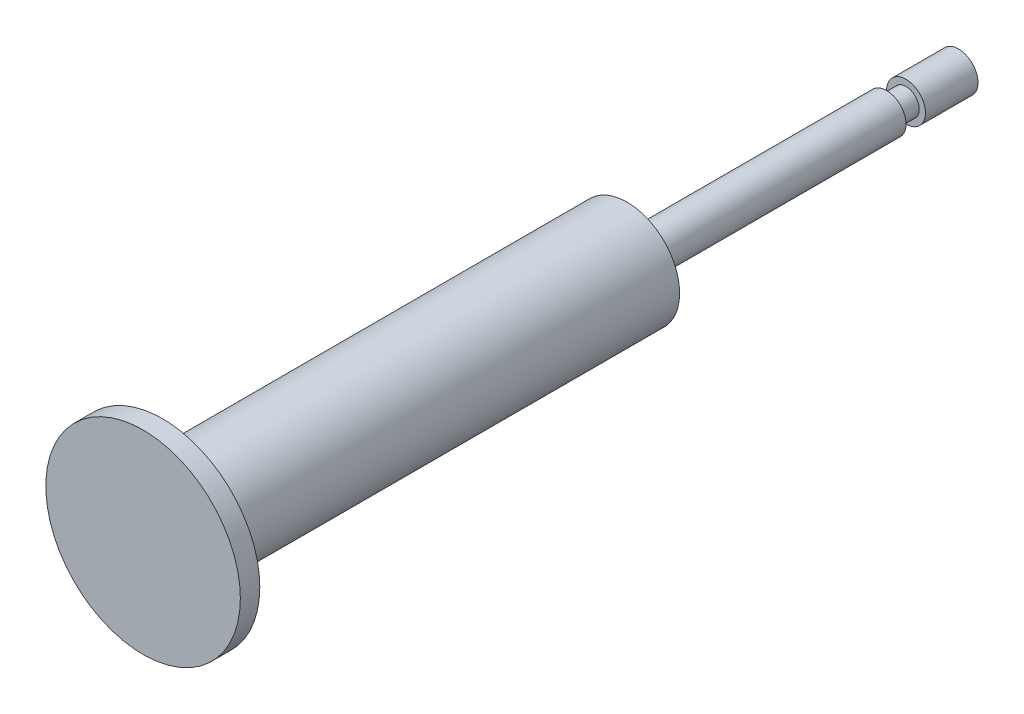
ISO-10303-21;
HEADER;
FILE_DESCRIPTION(('STEP AP214'),'2;1');
FILE_NAME('part.step','',(''),(''),'','','');
FILE_SCHEMA(('AUTOMOTIVE_DESIGN { 1 0 10303 214 1 1 1 1 }'));
ENDSEC;
DATA;
#1=APPLICATION_CONTEXT('core data for automotive mechanical design processes');
#2=APPLICATION_PROTOCOL_DEFINITION('international standard','automotive_design',2000,#1);
#3=PRODUCT_CONTEXT('',#1,'mechanical');
#4=PRODUCT('Part','Part','',(#3));
#5=PRODUCT_RELATED_PRODUCT_CATEGORY('part','',(#4));
#6=PRODUCT_DEFINITION_FORMATION('','',#4);
#7=PRODUCT_DEFINITION_CONTEXT('part definition',#1,'design');
#8=PRODUCT_DEFINITION('design','',#6,#7);
#9=PRODUCT_DEFINITION_SHAPE('','',#8);
#10=(LENGTH_UNIT() NAMED_UNIT(*) SI_UNIT(.MILLI.,.METRE.));
#11=(NAMED_UNIT(*) PLANE_ANGLE_UNIT() SI_UNIT($,.RADIAN.));
#12=(NAMED_UNIT(*) SI_UNIT($,.STERADIAN.) SOLID_ANGLE_UNIT());
#13=UNCERTAINTY_MEASURE_WITH_UNIT(LENGTH_MEASURE(1.E-05),#10,'distance_accuracy_value','');
#14=(GEOMETRIC_REPRESENTATION_CONTEXT(3) GLOBAL_UNCERTAINTY_ASSIGNED_CONTEXT((#13)) GLOBAL_UNIT_ASSIGNED_CONTEXT((#10,
#11,#12)) REPRESENTATION_CONTEXT('',''));
#15=CARTESIAN_POINT('',(0.,0.,0.));
#16=DIRECTION('',(0.,0.,1.));
#17=DIRECTION('',(1.,0.,0.));
#18=AXIS2_PLACEMENT_3D('',#15,#16,#17);
#19=CARTESIAN_POINT('',(0.,0.,-60.1462613559441));
#20=DIRECTION('',(0.,0.,1.));
#21=DIRECTION('',(1.,0.,0.));
#22=AXIS2_PLACEMENT_3D('',#19,#20,#21);
#23=CYLINDRICAL_SURFACE('',#22,2.5);
#24=CARTESIAN_POINT('',(0.,0.,-20.));
#25=DIRECTION('',(0.,0.,1.));
#26=DIRECTION('',(1.,0.,0.));
#27=AXIS2_PLACEMENT_3D('',#24,#25,#26);
#28=CIRCLE('',#27,2.5);
#29=CARTESIAN_POINT('',(2.5,0.,-20.));
#30=VERTEX_POINT('',#29);
#31=EDGE_CURVE('E65',#30,#30,#28,.F.);
#32=ORIENTED_EDGE('',*,*,#31,.T.);
#33=EDGE_LOOP('',(#32));
#34=FACE_BOUND('',#33,.T.);
#35=CARTESIAN_POINT('',(0.,0.,-50.8962613559441));
#36=DIRECTION('',(0.,0.,-1.));
#37=DIRECTION('',(-1.,0.,0.));
#38=AXIS2_PLACEMENT_3D('',#35,#36,#37);
#39=CIRCLE('',#38,2.5);
#40=CARTESIAN_POINT('',(-2.5,0.,-50.8962613559441));
#41=VERTEX_POINT('',#40);
#42=EDGE_CURVE('E71',#41,#41,#39,.T.);
#43=ORIENTED_EDGE('',*,*,#42,.F.);
#44=EDGE_LOOP('',(#43));
#45=FACE_BOUND('',#44,.T.);
#46=ADVANCED_FACE('F45',(#34,#45),#23,.T.);
#47=CARTESIAN_POINT('',(0.,0.,-17.5462613559441));
#48=DIRECTION('',(0.,0.,1.));
#49=DIRECTION('',(1.,0.,0.));
#50=AXIS2_PLACEMENT_3D('',#47,#48,#49);
#51=CONICAL_SURFACE('',#50,6.75,1.0471975511966);
#52=ORIENTED_EDGE('',*,*,#31,.F.);
#53=EDGE_LOOP('',(#52));
#54=FACE_BOUND('',#53,.T.);
#55=CARTESIAN_POINT('',(0.,0.,-17.5462613559441));
#56=DIRECTION('',(0.,0.,1.));
#57=DIRECTION('',(1.,0.,0.));
#58=AXIS2_PLACEMENT_3D('',#55,#56,#57);
#59=CIRCLE('',#58,6.75);
#60=CARTESIAN_POINT('',(6.75,0.,-17.5462613559441));
#61=VERTEX_POINT('',#60);
#62=EDGE_CURVE('E12',#61,#61,#59,.T.);
#63=ORIENTED_EDGE('',*,*,#62,.F.);
#64=EDGE_LOOP('',(#63));
#65=FACE_BOUND('',#64,.T.);
#66=ADVANCED_FACE('F47',(#54,#65),#51,.T.);
#67=CARTESIAN_POINT('',(0.,0.,72.3910699241786));
#68=DIRECTION('',(0.,0.,1.));
#69=DIRECTION('',(1.,0.,0.));
#70=AXIS2_PLACEMENT_3D('',#67,#68,#69);
#71=CYLINDRICAL_SURFACE('',#70,6.75);
#72=ORIENTED_EDGE('',*,*,#62,.T.);
#73=EDGE_LOOP('',(#72));
#74=FACE_BOUND('',#73,.T.);
#75=CARTESIAN_POINT('',(0.,0.,42.1537386440559));
#76=DIRECTION('',(0.,0.,-1.));
#77=DIRECTION('',(-1.,0.,0.));
#78=AXIS2_PLACEMENT_3D('',#75,#76,#77);
#79=CIRCLE('',#78,6.75);
#80=CARTESIAN_POINT('',(-6.75,0.,42.1537386440559));
#81=VERTEX_POINT('',#80);
#82=EDGE_CURVE('E60',#81,#81,#79,.T.);
#83=ORIENTED_EDGE('',*,*,#82,.T.);
#84=EDGE_LOOP('',(#83));
#85=FACE_BOUND('',#84,.T.);
#86=ADVANCED_FACE('F102',(#74,#85),#71,.T.);
#87=CARTESIAN_POINT('',(0.,0.,42.1537386440559));
#88=DIRECTION('',(0.,0.,-1.));
#89=DIRECTION('',(-1.,0.,0.));
#90=AXIS2_PLACEMENT_3D('',#87,#88,#89);
#91=PLANE('',#90);
#92=ORIENTED_EDGE('',*,*,#82,.F.);
#93=EDGE_LOOP('',(#92));
#94=FACE_BOUND('',#93,.T.);
#95=CARTESIAN_POINT('',(0.,0.,42.1537386440559));
#96=DIRECTION('',(0.,0.,-1.));
#97=DIRECTION('',(-1.,0.,0.));
#98=AXIS2_PLACEMENT_3D('',#95,#96,#97);
#99=CIRCLE('',#98,12.5);
#100=CARTESIAN_POINT('',(-12.5,0.,42.1537386440559));
#101=VERTEX_POINT('',#100);
#102=EDGE_CURVE('E56',#101,#101,#99,.T.);
#103=ORIENTED_EDGE('',*,*,#102,.T.);
#104=EDGE_LOOP('',(#103));
#105=FACE_BOUND('',#104,.T.);
#106=ADVANCED_FACE('F167',(#94,#105),#91,.T.);
#107=CARTESIAN_POINT('',(0.,0.,44.6537386440559));
#108=DIRECTION('',(0.,0.,1.));
#109=DIRECTION('',(1.,0.,0.));
#110=AXIS2_PLACEMENT_3D('',#107,#108,#109);
#111=PLANE('',#110);
#112=CARTESIAN_POINT('',(0.,0.,44.6537386440559));
#113=DIRECTION('',(0.,0.,1.));
#114=DIRECTION('',(1.,0.,0.));
#115=AXIS2_PLACEMENT_3D('',#112,#113,#114);
#116=CIRCLE('',#115,12.5);
#117=CARTESIAN_POINT('',(12.5,0.,44.6537386440559));
#118=VERTEX_POINT('',#117);
#119=EDGE_CURVE('E52',#118,#118,#116,.T.);
#120=ORIENTED_EDGE('',*,*,#119,.T.);
#121=EDGE_LOOP('',(#120));
#122=FACE_BOUND('',#121,.T.);
#123=ADVANCED_FACE('F138',(#122),#111,.T.);
#124=CARTESIAN_POINT('',(0.,0.,72.3910699241786));
#125=DIRECTION('',(0.,0.,1.));
#126=DIRECTION('',(1.,0.,0.));
#127=AXIS2_PLACEMENT_3D('',#124,#125,#126);
#128=CYLINDRICAL_SURFACE('',#127,12.5);
#129=ORIENTED_EDGE('',*,*,#119,.F.);
#130=EDGE_LOOP('',(#129));
#131=FACE_BOUND('',#130,.T.);
#132=ORIENTED_EDGE('',*,*,#102,.F.);
#133=EDGE_LOOP('',(#132));
#134=FACE_BOUND('',#133,.T.);
#135=ADVANCED_FACE('F91',(#131,#134),#128,.T.);
#136=CARTESIAN_POINT('',(0.,0.,-50.8962613559441));
#137=DIRECTION('',(0.,0.,-1.));
#138=DIRECTION('',(-1.,0.,0.));
#139=AXIS2_PLACEMENT_3D('',#136,#137,#138);
#140=PLANE('',#139);
#141=CARTESIAN_POINT('',(0.,0.,-50.8962613559441));
#142=DIRECTION('',(0.,0.,-1.));
#143=DIRECTION('',(-1.,0.,0.));
#144=AXIS2_PLACEMENT_3D('',#141,#142,#143);
#145=CIRCLE('',#144,1.7);
#146=CARTESIAN_POINT('',(-1.7,0.,-50.8962613559441));
#147=VERTEX_POINT('',#146);
#148=EDGE_CURVE('E75',#147,#147,#145,.T.);
#149=ORIENTED_EDGE('',*,*,#148,.F.);
#150=EDGE_LOOP('',(#149));
#151=FACE_BOUND('',#150,.T.);
#152=ORIENTED_EDGE('',*,*,#42,.T.);
#153=EDGE_LOOP('',(#152));
#154=FACE_BOUND('',#153,.T.);
#155=ADVANCED_FACE('F87',(#151,#154),#140,.T.);
#156=CARTESIAN_POINT('',(0.,0.,-53.3962613559441));
#157=DIRECTION('',(0.,0.,-1.));
#158=DIRECTION('',(-1.,0.,0.));
#159=AXIS2_PLACEMENT_3D('',#156,#157,#158);
#160=PLANE('',#159);
#161=CARTESIAN_POINT('',(0.,0.,-53.3962613559441));
#162=DIRECTION('',(0.,0.,-1.));
#163=DIRECTION('',(-1.,0.,0.));
#164=AXIS2_PLACEMENT_3D('',#161,#162,#163);
#165=CIRCLE('',#164,1.7);
#166=CARTESIAN_POINT('',(-1.7,0.,-53.3962613559441));
#167=VERTEX_POINT('',#166);
#168=EDGE_CURVE('E78',#167,#167,#165,.T.);
#169=ORIENTED_EDGE('',*,*,#168,.T.);
#170=EDGE_LOOP('',(#169));
#171=FACE_BOUND('',#170,.T.);
#172=CARTESIAN_POINT('',(0.,0.,-53.3962613559441));
#173=DIRECTION('',(0.,0.,-1.));
#174=DIRECTION('',(-1.,0.,0.));
#175=AXIS2_PLACEMENT_3D('',#172,#173,#174);
#176=CIRCLE('',#175,2.5);
#177=CARTESIAN_POINT('',(-2.5,0.,-53.3962613559441));
#178=VERTEX_POINT('',#177);
#179=EDGE_CURVE('E72',#178,#178,#176,.T.);
#180=ORIENTED_EDGE('',*,*,#179,.F.);
#181=EDGE_LOOP('',(#180));
#182=FACE_BOUND('',#181,.T.);
#183=ADVANCED_FACE('F90',(#171,#182),#160,.F.);
#184=CARTESIAN_POINT('',(0.,0.,-50.8962613559441));
#185=DIRECTION('',(0.,0.,-1.));
#186=DIRECTION('',(-1.,0.,0.));
#187=AXIS2_PLACEMENT_3D('',#184,#185,#186);
#188=CYLINDRICAL_SURFACE('',#187,1.7);
#189=ORIENTED_EDGE('',*,*,#148,.T.);
#190=EDGE_LOOP('',(#189));
#191=FACE_BOUND('',#190,.T.);
#192=ORIENTED_EDGE('',*,*,#168,.F.);
#193=EDGE_LOOP('',(#192));
#194=FACE_BOUND('',#193,.T.);
#195=ADVANCED_FACE('F84',(#191,#194),#188,.T.);
#196=CARTESIAN_POINT('',(0.,0.,-60.1462613559441));
#197=DIRECTION('',(0.,0.,1.));
#198=DIRECTION('',(1.,0.,0.));
#199=AXIS2_PLACEMENT_3D('',#196,#197,#198);
#200=PLANE('',#199);
#201=CARTESIAN_POINT('',(0.,0.,-60.1462613559441));
#202=DIRECTION('',(0.,0.,1.));
#203=DIRECTION('',(1.,0.,0.));
#204=AXIS2_PLACEMENT_3D('',#201,#202,#203);
#205=CIRCLE('',#204,2.5);
#206=CARTESIAN_POINT('',(2.5,0.,-60.1462613559441));
#207=VERTEX_POINT('',#206);
#208=EDGE_CURVE('E68',#207,#207,#205,.T.);
#209=ORIENTED_EDGE('',*,*,#208,.F.);
#210=EDGE_LOOP('',(#209));
#211=FACE_BOUND('',#210,.T.);
#212=ADVANCED_FACE('F107',(#211),#200,.F.);
#213=ORIENTED_EDGE('',*,*,#179,.T.);
#214=EDGE_LOOP('',(#213));
#215=FACE_BOUND('',#214,.T.);
#216=ORIENTED_EDGE('',*,*,#208,.T.);
#217=EDGE_LOOP('',(#216));
#218=FACE_BOUND('',#217,.T.);
#219=ADVANCED_FACE('F98',(#215,#218),#23,.T.);
#220=CLOSED_SHELL('',(#46,#66,#86,#106,#123,#135,#155,#183,#195,#212,#219));
#221=MANIFOLD_SOLID_BREP('B2',#220);
#222=ADVANCED_BREP_SHAPE_REPRESENTATION('',(#18,#221),#14);
#223=SHAPE_DEFINITION_REPRESENTATION(#9,#222);
ENDSEC;
END-ISO-10303-21;
